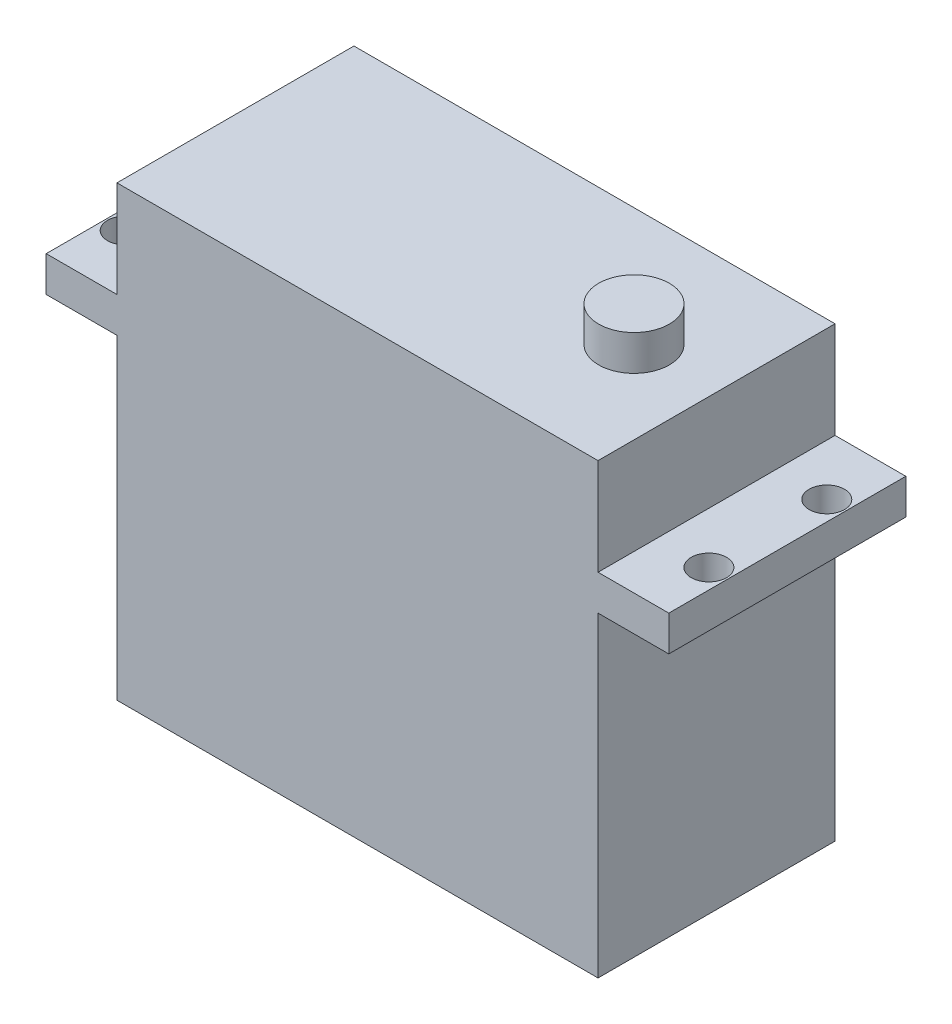
ISO-10303-21;
HEADER;
FILE_DESCRIPTION(('STEP AP214'),'2;1');
FILE_NAME('part.step','',(''),(''),'','','');
FILE_SCHEMA(('AUTOMOTIVE_DESIGN { 1 0 10303 214 1 1 1 1 }'));
ENDSEC;
DATA;
#1=APPLICATION_CONTEXT('core data for automotive mechanical design processes');
#2=APPLICATION_PROTOCOL_DEFINITION('international standard','automotive_design',2000,#1);
#3=PRODUCT_CONTEXT('',#1,'mechanical');
#4=PRODUCT('Part','Part','',(#3));
#5=PRODUCT_RELATED_PRODUCT_CATEGORY('part','',(#4));
#6=PRODUCT_DEFINITION_FORMATION('','',#4);
#7=PRODUCT_DEFINITION_CONTEXT('part definition',#1,'design');
#8=PRODUCT_DEFINITION('design','',#6,#7);
#9=PRODUCT_DEFINITION_SHAPE('','',#8);
#10=(LENGTH_UNIT() NAMED_UNIT(*) SI_UNIT(.MILLI.,.METRE.));
#11=(NAMED_UNIT(*) PLANE_ANGLE_UNIT() SI_UNIT($,.RADIAN.));
#12=(NAMED_UNIT(*) SI_UNIT($,.STERADIAN.) SOLID_ANGLE_UNIT());
#13=UNCERTAINTY_MEASURE_WITH_UNIT(LENGTH_MEASURE(1.E-05),#10,'distance_accuracy_value','');
#14=(GEOMETRIC_REPRESENTATION_CONTEXT(3) GLOBAL_UNCERTAINTY_ASSIGNED_CONTEXT((#13)) GLOBAL_UNIT_ASSIGNED_CONTEXT((#10,
#11,#12)) REPRESENTATION_CONTEXT('',''));
#15=CARTESIAN_POINT('',(0.,0.,0.));
#16=DIRECTION('',(0.,0.,1.));
#17=DIRECTION('',(1.,0.,0.));
#18=AXIS2_PLACEMENT_3D('',#15,#16,#17);
#19=CARTESIAN_POINT('',(0.,26.8,20.1));
#20=DIRECTION('',(1.,0.,0.));
#21=DIRECTION('',(0.,1.,0.));
#22=AXIS2_PLACEMENT_3D('',#19,#20,#21);
#23=PLANE('',#22);
#24=DIRECTION('',(0.,-1.,0.));
#25=VECTOR('',#24,1.);
#26=CARTESIAN_POINT('',(0.,26.8,0.));
#27=LINE('',#26,#25);
#28=CARTESIAN_POINT('',(0.,26.8,0.));
#29=VERTEX_POINT('',#28);
#30=CARTESIAN_POINT('',(0.,0.,0.));
#31=VERTEX_POINT('',#30);
#32=EDGE_CURVE('E164',#29,#31,#27,.T.);
#33=ORIENTED_EDGE('',*,*,#32,.T.);
#34=DIRECTION('',(0.,0.,-1.));
#35=VECTOR('',#34,1.);
#36=CARTESIAN_POINT('',(0.,0.,20.1));
#37=LINE('',#36,#35);
#38=CARTESIAN_POINT('',(0.,0.,20.1));
#39=VERTEX_POINT('',#38);
#40=EDGE_CURVE('E47',#39,#31,#37,.T.);
#41=ORIENTED_EDGE('',*,*,#40,.F.);
#42=DIRECTION('',(0.,-1.,0.));
#43=VECTOR('',#42,1.);
#44=CARTESIAN_POINT('',(0.,26.8,20.1));
#45=LINE('',#44,#43);
#46=CARTESIAN_POINT('',(0.,26.8,20.1));
#47=VERTEX_POINT('',#46);
#48=EDGE_CURVE('E199',#47,#39,#45,.T.);
#49=ORIENTED_EDGE('',*,*,#48,.F.);
#50=DIRECTION('',(0.,0.,-1.));
#51=VECTOR('',#50,1.);
#52=CARTESIAN_POINT('',(0.,26.8,20.1));
#53=LINE('',#52,#51);
#54=EDGE_CURVE('E160',#47,#29,#53,.T.);
#55=ORIENTED_EDGE('',*,*,#54,.T.);
#56=EDGE_LOOP('',(#33,#41,#49,#55));
#57=FACE_BOUND('',#56,.T.);
#58=ADVANCED_FACE('F38',(#57),#23,.F.);
#59=CARTESIAN_POINT('',(0.,0.,20.1));
#60=DIRECTION('',(0.,1.,0.));
#61=DIRECTION('',(0.,0.,1.));
#62=AXIS2_PLACEMENT_3D('',#59,#60,#61);
#63=PLANE('',#62);
#64=DIRECTION('',(1.,0.,0.));
#65=VECTOR('',#64,1.);
#66=CARTESIAN_POINT('',(0.,0.,0.));
#67=LINE('',#66,#65);
#68=CARTESIAN_POINT('',(40.8,0.,0.));
#69=VERTEX_POINT('',#68);
#70=EDGE_CURVE('E168',#31,#69,#67,.T.);
#71=ORIENTED_EDGE('',*,*,#70,.T.);
#72=DIRECTION('',(0.,0.,-1.));
#73=VECTOR('',#72,1.);
#74=CARTESIAN_POINT('',(40.8,0.,20.1));
#75=LINE('',#74,#73);
#76=CARTESIAN_POINT('',(40.8,0.,20.1));
#77=VERTEX_POINT('',#76);
#78=EDGE_CURVE('E230',#77,#69,#75,.T.);
#79=ORIENTED_EDGE('',*,*,#78,.F.);
#80=DIRECTION('',(1.,0.,0.));
#81=VECTOR('',#80,1.);
#82=CARTESIAN_POINT('',(0.,0.,20.1));
#83=LINE('',#82,#81);
#84=EDGE_CURVE('E111',#39,#77,#83,.T.);
#85=ORIENTED_EDGE('',*,*,#84,.F.);
#86=ORIENTED_EDGE('',*,*,#40,.T.);
#87=EDGE_LOOP('',(#71,#79,#85,#86));
#88=FACE_BOUND('',#87,.T.);
#89=ADVANCED_FACE('F235',(#88),#63,.F.);
#90=CARTESIAN_POINT('',(40.8,0.,20.1));
#91=DIRECTION('',(-1.,0.,0.));
#92=DIRECTION('',(0.,0.,1.));
#93=AXIS2_PLACEMENT_3D('',#90,#91,#92);
#94=PLANE('',#93);
#95=DIRECTION('',(0.,1.,0.));
#96=VECTOR('',#95,1.);
#97=CARTESIAN_POINT('',(40.8,0.,0.));
#98=LINE('',#97,#96);
#99=CARTESIAN_POINT('',(40.8,26.8,0.));
#100=VERTEX_POINT('',#99);
#101=EDGE_CURVE('E172',#69,#100,#98,.T.);
#102=ORIENTED_EDGE('',*,*,#101,.T.);
#103=DIRECTION('',(0.,0.,-1.));
#104=VECTOR('',#103,1.);
#105=CARTESIAN_POINT('',(40.8,26.8,20.1));
#106=LINE('',#105,#104);
#107=CARTESIAN_POINT('',(40.8,26.8,20.1));
#108=VERTEX_POINT('',#107);
#109=EDGE_CURVE('E226',#108,#100,#106,.T.);
#110=ORIENTED_EDGE('',*,*,#109,.F.);
#111=DIRECTION('',(0.,1.,0.));
#112=VECTOR('',#111,1.);
#113=CARTESIAN_POINT('',(40.8,0.,20.1));
#114=LINE('',#113,#112);
#115=EDGE_CURVE('E256',#77,#108,#114,.T.);
#116=ORIENTED_EDGE('',*,*,#115,.F.);
#117=ORIENTED_EDGE('',*,*,#78,.T.);
#118=EDGE_LOOP('',(#102,#110,#116,#117));
#119=FACE_BOUND('',#118,.T.);
#120=ADVANCED_FACE('F246',(#119),#94,.F.);
#121=CARTESIAN_POINT('',(40.8,26.8,20.1));
#122=DIRECTION('',(0.,1.,0.));
#123=DIRECTION('',(0.,0.,1.));
#124=AXIS2_PLACEMENT_3D('',#121,#122,#123);
#125=PLANE('',#124);
#126=CARTESIAN_POINT('',(45.15,26.8,5.05));
#127=DIRECTION('',(0.,1.,0.));
#128=DIRECTION('',(0.,0.,1.));
#129=AXIS2_PLACEMENT_3D('',#126,#127,#128);
#130=CIRCLE('',#129,1.5);
#131=CARTESIAN_POINT('',(45.15,26.8,6.55));
#132=VERTEX_POINT('',#131);
#133=EDGE_CURVE('E480',#132,#132,#130,.F.);
#134=ORIENTED_EDGE('',*,*,#133,.F.);
#135=EDGE_LOOP('',(#134));
#136=FACE_BOUND('',#135,.T.);
#137=CARTESIAN_POINT('',(45.15,26.8,15.05));
#138=DIRECTION('',(0.,1.,0.));
#139=DIRECTION('',(0.,0.,1.));
#140=AXIS2_PLACEMENT_3D('',#137,#138,#139);
#141=CIRCLE('',#140,1.5);
#142=CARTESIAN_POINT('',(45.15,26.8,16.55));
#143=VERTEX_POINT('',#142);
#144=EDGE_CURVE('E467',#143,#143,#141,.F.);
#145=ORIENTED_EDGE('',*,*,#144,.F.);
#146=EDGE_LOOP('',(#145));
#147=FACE_BOUND('',#146,.T.);
#148=DIRECTION('',(1.,0.,0.));
#149=VECTOR('',#148,1.);
#150=CARTESIAN_POINT('',(40.8,26.8,0.));
#151=LINE('',#150,#149);
#152=CARTESIAN_POINT('',(46.8,26.8,0.));
#153=VERTEX_POINT('',#152);
#154=EDGE_CURVE('E175',#100,#153,#151,.T.);
#155=ORIENTED_EDGE('',*,*,#154,.T.);
#156=DIRECTION('',(0.,0.,-1.));
#157=VECTOR('',#156,1.);
#158=CARTESIAN_POINT('',(46.8,26.8,20.1));
#159=LINE('',#158,#157);
#160=CARTESIAN_POINT('',(46.8,26.8,20.1));
#161=VERTEX_POINT('',#160);
#162=EDGE_CURVE('E222',#161,#153,#159,.T.);
#163=ORIENTED_EDGE('',*,*,#162,.F.);
#164=DIRECTION('',(1.,0.,0.));
#165=VECTOR('',#164,1.);
#166=CARTESIAN_POINT('',(40.8,26.8,20.1));
#167=LINE('',#166,#165);
#168=EDGE_CURVE('E252',#108,#161,#167,.T.);
#169=ORIENTED_EDGE('',*,*,#168,.F.);
#170=ORIENTED_EDGE('',*,*,#109,.T.);
#171=EDGE_LOOP('',(#155,#163,#169,#170));
#172=FACE_BOUND('',#171,.T.);
#173=ADVANCED_FACE('F250',(#136,#147,#172),#125,.F.);
#174=CARTESIAN_POINT('',(46.8,26.8,20.1));
#175=DIRECTION('',(-1.,0.,0.));
#176=DIRECTION('',(0.,0.,1.));
#177=AXIS2_PLACEMENT_3D('',#174,#175,#176);
#178=PLANE('',#177);
#179=DIRECTION('',(0.,1.,0.));
#180=VECTOR('',#179,1.);
#181=CARTESIAN_POINT('',(46.8,26.8,0.));
#182=LINE('',#181,#180);
#183=CARTESIAN_POINT('',(46.8,29.8,0.));
#184=VERTEX_POINT('',#183);
#185=EDGE_CURVE('E178',#153,#184,#182,.T.);
#186=ORIENTED_EDGE('',*,*,#185,.T.);
#187=DIRECTION('',(0.,0.,-1.));
#188=VECTOR('',#187,1.);
#189=CARTESIAN_POINT('',(46.8,29.8,20.1));
#190=LINE('',#189,#188);
#191=CARTESIAN_POINT('',(46.8,29.8,20.1));
#192=VERTEX_POINT('',#191);
#193=EDGE_CURVE('E218',#192,#184,#190,.T.);
#194=ORIENTED_EDGE('',*,*,#193,.F.);
#195=DIRECTION('',(0.,1.,0.));
#196=VECTOR('',#195,1.);
#197=CARTESIAN_POINT('',(46.8,26.8,20.1));
#198=LINE('',#197,#196);
#199=EDGE_CURVE('E255',#161,#192,#198,.T.);
#200=ORIENTED_EDGE('',*,*,#199,.F.);
#201=ORIENTED_EDGE('',*,*,#162,.T.);
#202=EDGE_LOOP('',(#186,#194,#200,#201));
#203=FACE_BOUND('',#202,.T.);
#204=ADVANCED_FACE('F293',(#203),#178,.F.);
#205=CARTESIAN_POINT('',(46.8,29.8,20.1));
#206=DIRECTION('',(0.,-1.,0.));
#207=DIRECTION('',(0.,0.,-1.));
#208=AXIS2_PLACEMENT_3D('',#205,#206,#207);
#209=PLANE('',#208);
#210=CARTESIAN_POINT('',(45.15,29.8,5.05));
#211=DIRECTION('',(0.,1.,0.));
#212=DIRECTION('',(0.,0.,1.));
#213=AXIS2_PLACEMENT_3D('',#210,#211,#212);
#214=CIRCLE('',#213,1.5);
#215=CARTESIAN_POINT('',(45.15,29.8,6.55));
#216=VERTEX_POINT('',#215);
#217=EDGE_CURVE('E494',#216,#216,#214,.T.);
#218=ORIENTED_EDGE('',*,*,#217,.F.);
#219=EDGE_LOOP('',(#218));
#220=FACE_BOUND('',#219,.T.);
#221=CARTESIAN_POINT('',(45.15,29.8,15.05));
#222=DIRECTION('',(0.,1.,0.));
#223=DIRECTION('',(0.,0.,1.));
#224=AXIS2_PLACEMENT_3D('',#221,#222,#223);
#225=CIRCLE('',#224,1.5);
#226=CARTESIAN_POINT('',(45.15,29.8,16.55));
#227=VERTEX_POINT('',#226);
#228=EDGE_CURVE('E471',#227,#227,#225,.T.);
#229=ORIENTED_EDGE('',*,*,#228,.F.);
#230=EDGE_LOOP('',(#229));
#231=FACE_BOUND('',#230,.T.);
#232=DIRECTION('',(-1.,0.,0.));
#233=VECTOR('',#232,1.);
#234=CARTESIAN_POINT('',(46.8,29.8,0.));
#235=LINE('',#234,#233);
#236=CARTESIAN_POINT('',(40.8,29.8,0.));
#237=VERTEX_POINT('',#236);
#238=EDGE_CURVE('E181',#184,#237,#235,.T.);
#239=ORIENTED_EDGE('',*,*,#238,.T.);
#240=DIRECTION('',(0.,0.,-1.));
#241=VECTOR('',#240,1.);
#242=CARTESIAN_POINT('',(40.8,29.8,20.1));
#243=LINE('',#242,#241);
#244=CARTESIAN_POINT('',(40.8,29.8,20.1));
#245=VERTEX_POINT('',#244);
#246=EDGE_CURVE('E214',#245,#237,#243,.T.);
#247=ORIENTED_EDGE('',*,*,#246,.F.);
#248=DIRECTION('',(-1.,0.,0.));
#249=VECTOR('',#248,1.);
#250=CARTESIAN_POINT('',(46.8,29.8,20.1));
#251=LINE('',#250,#249);
#252=EDGE_CURVE('E260',#192,#245,#251,.T.);
#253=ORIENTED_EDGE('',*,*,#252,.F.);
#254=ORIENTED_EDGE('',*,*,#193,.T.);
#255=EDGE_LOOP('',(#239,#247,#253,#254));
#256=FACE_BOUND('',#255,.T.);
#257=ADVANCED_FACE('F290',(#220,#231,#256),#209,.F.);
#258=CARTESIAN_POINT('',(40.8,29.8,20.1));
#259=DIRECTION('',(-1.,0.,0.));
#260=DIRECTION('',(0.,0.,1.));
#261=AXIS2_PLACEMENT_3D('',#258,#259,#260);
#262=PLANE('',#261);
#263=DIRECTION('',(0.,1.,0.));
#264=VECTOR('',#263,1.);
#265=CARTESIAN_POINT('',(40.8,29.8,0.));
#266=LINE('',#265,#264);
#267=CARTESIAN_POINT('',(40.8,38.,0.));
#268=VERTEX_POINT('',#267);
#269=EDGE_CURVE('E184',#237,#268,#266,.T.);
#270=ORIENTED_EDGE('',*,*,#269,.T.);
#271=DIRECTION('',(0.,0.,-1.));
#272=VECTOR('',#271,1.);
#273=CARTESIAN_POINT('',(40.8,38.,20.1));
#274=LINE('',#273,#272);
#275=CARTESIAN_POINT('',(40.8,38.,20.1));
#276=VERTEX_POINT('',#275);
#277=EDGE_CURVE('E210',#276,#268,#274,.T.);
#278=ORIENTED_EDGE('',*,*,#277,.F.);
#279=DIRECTION('',(0.,1.,0.));
#280=VECTOR('',#279,1.);
#281=CARTESIAN_POINT('',(40.8,29.8,20.1));
#282=LINE('',#281,#280);
#283=EDGE_CURVE('E267',#245,#276,#282,.T.);
#284=ORIENTED_EDGE('',*,*,#283,.F.);
#285=ORIENTED_EDGE('',*,*,#246,.T.);
#286=EDGE_LOOP('',(#270,#278,#284,#285));
#287=FACE_BOUND('',#286,.T.);
#288=ADVANCED_FACE('F286',(#287),#262,.F.);
#289=CARTESIAN_POINT('',(40.8,38.,20.1));
#290=DIRECTION('',(0.,-1.,0.));
#291=DIRECTION('',(1.,0.,0.));
#292=AXIS2_PLACEMENT_3D('',#289,#290,#291);
#293=PLANE('',#292);
#294=CARTESIAN_POINT('',(33.8,38.,10.05));
#295=DIRECTION('',(0.,-1.,0.));
#296=DIRECTION('',(1.,0.,0.));
#297=AXIS2_PLACEMENT_3D('',#294,#295,#296);
#298=CIRCLE('',#297,3.);
#299=CARTESIAN_POINT('',(36.8,38.,10.05));
#300=VERTEX_POINT('',#299);
#301=EDGE_CURVE('E11',#300,#300,#298,.F.);
#302=ORIENTED_EDGE('',*,*,#301,.F.);
#303=EDGE_LOOP('',(#302));
#304=FACE_BOUND('',#303,.T.);
#305=DIRECTION('',(-1.,0.,0.));
#306=VECTOR('',#305,1.);
#307=CARTESIAN_POINT('',(40.8,38.,0.));
#308=LINE('',#307,#306);
#309=CARTESIAN_POINT('',(0.,38.,0.));
#310=VERTEX_POINT('',#309);
#311=EDGE_CURVE('E187',#268,#310,#308,.T.);
#312=ORIENTED_EDGE('',*,*,#311,.T.);
#313=DIRECTION('',(0.,0.,-1.));
#314=VECTOR('',#313,1.);
#315=CARTESIAN_POINT('',(0.,38.,20.1));
#316=LINE('',#315,#314);
#317=CARTESIAN_POINT('',(0.,38.,20.1));
#318=VERTEX_POINT('',#317);
#319=EDGE_CURVE('E206',#318,#310,#316,.T.);
#320=ORIENTED_EDGE('',*,*,#319,.F.);
#321=DIRECTION('',(-1.,0.,0.));
#322=VECTOR('',#321,1.);
#323=CARTESIAN_POINT('',(40.8,38.,20.1));
#324=LINE('',#323,#322);
#325=EDGE_CURVE('E270',#276,#318,#324,.T.);
#326=ORIENTED_EDGE('',*,*,#325,.F.);
#327=ORIENTED_EDGE('',*,*,#277,.T.);
#328=EDGE_LOOP('',(#312,#320,#326,#327));
#329=FACE_BOUND('',#328,.T.);
#330=ADVANCED_FACE('F278',(#304,#329),#293,.F.);
#331=CARTESIAN_POINT('',(0.,38.,20.1));
#332=DIRECTION('',(1.,0.,0.));
#333=DIRECTION('',(0.,1.,0.));
#334=AXIS2_PLACEMENT_3D('',#331,#332,#333);
#335=PLANE('',#334);
#336=DIRECTION('',(0.,-1.,0.));
#337=VECTOR('',#336,1.);
#338=CARTESIAN_POINT('',(0.,38.,0.));
#339=LINE('',#338,#337);
#340=CARTESIAN_POINT('',(0.,29.8,0.));
#341=VERTEX_POINT('',#340);
#342=EDGE_CURVE('E190',#310,#341,#339,.T.);
#343=ORIENTED_EDGE('',*,*,#342,.T.);
#344=DIRECTION('',(0.,0.,-1.));
#345=VECTOR('',#344,1.);
#346=CARTESIAN_POINT('',(0.,29.8,20.1));
#347=LINE('',#346,#345);
#348=CARTESIAN_POINT('',(0.,29.8,20.1));
#349=VERTEX_POINT('',#348);
#350=EDGE_CURVE('E153',#349,#341,#347,.T.);
#351=ORIENTED_EDGE('',*,*,#350,.F.);
#352=DIRECTION('',(0.,-1.,0.));
#353=VECTOR('',#352,1.);
#354=CARTESIAN_POINT('',(0.,38.,20.1));
#355=LINE('',#354,#353);
#356=EDGE_CURVE('E142',#318,#349,#355,.T.);
#357=ORIENTED_EDGE('',*,*,#356,.F.);
#358=ORIENTED_EDGE('',*,*,#319,.T.);
#359=EDGE_LOOP('',(#343,#351,#357,#358));
#360=FACE_BOUND('',#359,.T.);
#361=ADVANCED_FACE('F282',(#360),#335,.F.);
#362=CARTESIAN_POINT('',(0.,29.8,20.1));
#363=DIRECTION('',(0.,-1.,0.));
#364=DIRECTION('',(0.,0.,-1.));
#365=AXIS2_PLACEMENT_3D('',#362,#363,#364);
#366=PLANE('',#365);
#367=CARTESIAN_POINT('',(-4.35,29.8,15.05));
#368=DIRECTION('',(0.,1.,0.));
#369=DIRECTION('',(0.,0.,-1.));
#370=AXIS2_PLACEMENT_3D('',#367,#368,#369);
#371=CIRCLE('',#370,1.5);
#372=CARTESIAN_POINT('',(-4.35,29.8,13.55));
#373=VERTEX_POINT('',#372);
#374=EDGE_CURVE('E486',#373,#373,#371,.T.);
#375=ORIENTED_EDGE('',*,*,#374,.F.);
#376=EDGE_LOOP('',(#375));
#377=FACE_BOUND('',#376,.T.);
#378=CARTESIAN_POINT('',(-4.35,29.8,5.05));
#379=DIRECTION('',(0.,1.,0.));
#380=DIRECTION('',(0.,0.,-1.));
#381=AXIS2_PLACEMENT_3D('',#378,#379,#380);
#382=CIRCLE('',#381,1.5);
#383=CARTESIAN_POINT('',(-4.35,29.8,3.55));
#384=VERTEX_POINT('',#383);
#385=EDGE_CURVE('E485',#384,#384,#382,.T.);
#386=ORIENTED_EDGE('',*,*,#385,.F.);
#387=EDGE_LOOP('',(#386));
#388=FACE_BOUND('',#387,.T.);
#389=DIRECTION('',(-1.,0.,0.));
#390=VECTOR('',#389,1.);
#391=CARTESIAN_POINT('',(0.,29.8,0.));
#392=LINE('',#391,#390);
#393=CARTESIAN_POINT('',(-6.,29.8,0.));
#394=VERTEX_POINT('',#393);
#395=EDGE_CURVE('E151',#341,#394,#392,.T.);
#396=ORIENTED_EDGE('',*,*,#395,.T.);
#397=DIRECTION('',(0.,0.,-1.));
#398=VECTOR('',#397,1.);
#399=CARTESIAN_POINT('',(-6.,29.8,20.1));
#400=LINE('',#399,#398);
#401=CARTESIAN_POINT('',(-6.,29.8,20.1));
#402=VERTEX_POINT('',#401);
#403=EDGE_CURVE('E148',#402,#394,#400,.T.);
#404=ORIENTED_EDGE('',*,*,#403,.F.);
#405=DIRECTION('',(-1.,0.,0.));
#406=VECTOR('',#405,1.);
#407=CARTESIAN_POINT('',(0.,29.8,20.1));
#408=LINE('',#407,#406);
#409=EDGE_CURVE('E136',#349,#402,#408,.T.);
#410=ORIENTED_EDGE('',*,*,#409,.F.);
#411=ORIENTED_EDGE('',*,*,#350,.T.);
#412=EDGE_LOOP('',(#396,#404,#410,#411));
#413=FACE_BOUND('',#412,.T.);
#414=ADVANCED_FACE('F149',(#377,#388,#413),#366,.F.);
#415=CARTESIAN_POINT('',(-6.,29.8,20.1));
#416=DIRECTION('',(1.,0.,0.));
#417=DIRECTION('',(0.,0.,-1.));
#418=AXIS2_PLACEMENT_3D('',#415,#416,#417);
#419=PLANE('',#418);
#420=DIRECTION('',(0.,-1.,0.));
#421=VECTOR('',#420,1.);
#422=CARTESIAN_POINT('',(-6.,29.8,0.));
#423=LINE('',#422,#421);
#424=CARTESIAN_POINT('',(-6.,26.8,0.));
#425=VERTEX_POINT('',#424);
#426=EDGE_CURVE('E96',#394,#425,#423,.T.);
#427=ORIENTED_EDGE('',*,*,#426,.T.);
#428=DIRECTION('',(0.,0.,-1.));
#429=VECTOR('',#428,1.);
#430=CARTESIAN_POINT('',(-6.,26.8,20.1));
#431=LINE('',#430,#429);
#432=CARTESIAN_POINT('',(-6.,26.8,20.1));
#433=VERTEX_POINT('',#432);
#434=EDGE_CURVE('E154',#433,#425,#431,.T.);
#435=ORIENTED_EDGE('',*,*,#434,.F.);
#436=DIRECTION('',(0.,-1.,0.));
#437=VECTOR('',#436,1.);
#438=CARTESIAN_POINT('',(-6.,29.8,20.1));
#439=LINE('',#438,#437);
#440=EDGE_CURVE('E140',#402,#433,#439,.T.);
#441=ORIENTED_EDGE('',*,*,#440,.F.);
#442=ORIENTED_EDGE('',*,*,#403,.T.);
#443=EDGE_LOOP('',(#427,#435,#441,#442));
#444=FACE_BOUND('',#443,.T.);
#445=ADVANCED_FACE('F156',(#444),#419,.F.);
#446=CARTESIAN_POINT('',(-6.,26.8,20.1));
#447=DIRECTION('',(0.,1.,0.));
#448=DIRECTION('',(0.,0.,1.));
#449=AXIS2_PLACEMENT_3D('',#446,#447,#448);
#450=PLANE('',#449);
#451=CARTESIAN_POINT('',(-4.35,26.8,15.05));
#452=DIRECTION('',(0.,1.,0.));
#453=DIRECTION('',(0.,0.,1.));
#454=AXIS2_PLACEMENT_3D('',#451,#452,#453);
#455=CIRCLE('',#454,1.5);
#456=CARTESIAN_POINT('',(-4.35,26.8,16.55));
#457=VERTEX_POINT('',#456);
#458=EDGE_CURVE('E481',#457,#457,#455,.F.);
#459=ORIENTED_EDGE('',*,*,#458,.F.);
#460=EDGE_LOOP('',(#459));
#461=FACE_BOUND('',#460,.T.);
#462=CARTESIAN_POINT('',(-4.35,26.8,5.05));
#463=DIRECTION('',(0.,1.,0.));
#464=DIRECTION('',(0.,0.,1.));
#465=AXIS2_PLACEMENT_3D('',#462,#463,#464);
#466=CIRCLE('',#465,1.5);
#467=CARTESIAN_POINT('',(-4.35,26.8,6.55));
#468=VERTEX_POINT('',#467);
#469=EDGE_CURVE('E490',#468,#468,#466,.F.);
#470=ORIENTED_EDGE('',*,*,#469,.F.);
#471=EDGE_LOOP('',(#470));
#472=FACE_BOUND('',#471,.T.);
#473=DIRECTION('',(1.,0.,0.));
#474=VECTOR('',#473,1.);
#475=CARTESIAN_POINT('',(-6.,26.8,0.));
#476=LINE('',#475,#474);
#477=EDGE_CURVE('E102',#425,#29,#476,.T.);
#478=ORIENTED_EDGE('',*,*,#477,.T.);
#479=ORIENTED_EDGE('',*,*,#54,.F.);
#480=DIRECTION('',(1.,0.,0.));
#481=VECTOR('',#480,1.);
#482=CARTESIAN_POINT('',(-6.,26.8,20.1));
#483=LINE('',#482,#481);
#484=EDGE_CURVE('E55',#433,#47,#483,.T.);
#485=ORIENTED_EDGE('',*,*,#484,.F.);
#486=ORIENTED_EDGE('',*,*,#434,.T.);
#487=EDGE_LOOP('',(#478,#479,#485,#486));
#488=FACE_BOUND('',#487,.T.);
#489=ADVANCED_FACE('F344',(#461,#472,#488),#450,.F.);
#490=CARTESIAN_POINT('',(0.,0.,20.1));
#491=DIRECTION('',(0.,0.,1.));
#492=DIRECTION('',(1.,0.,0.));
#493=AXIS2_PLACEMENT_3D('',#490,#491,#492);
#494=PLANE('',#493);
#495=ORIENTED_EDGE('',*,*,#48,.T.);
#496=ORIENTED_EDGE('',*,*,#84,.T.);
#497=ORIENTED_EDGE('',*,*,#115,.T.);
#498=ORIENTED_EDGE('',*,*,#168,.T.);
#499=ORIENTED_EDGE('',*,*,#199,.T.);
#500=ORIENTED_EDGE('',*,*,#252,.T.);
#501=ORIENTED_EDGE('',*,*,#283,.T.);
#502=ORIENTED_EDGE('',*,*,#325,.T.);
#503=ORIENTED_EDGE('',*,*,#356,.T.);
#504=ORIENTED_EDGE('',*,*,#409,.T.);
#505=ORIENTED_EDGE('',*,*,#440,.T.);
#506=ORIENTED_EDGE('',*,*,#484,.T.);
#507=EDGE_LOOP('',(#495,#496,#497,#498,#499,#500,#501,#502,#503,#504,#505,#506));
#508=FACE_BOUND('',#507,.T.);
#509=ADVANCED_FACE('F138',(#508),#494,.T.);
#510=CARTESIAN_POINT('',(0.,0.,0.));
#511=DIRECTION('',(0.,0.,1.));
#512=DIRECTION('',(1.,0.,0.));
#513=AXIS2_PLACEMENT_3D('',#510,#511,#512);
#514=PLANE('',#513);
#515=ORIENTED_EDGE('',*,*,#32,.F.);
#516=ORIENTED_EDGE('',*,*,#477,.F.);
#517=ORIENTED_EDGE('',*,*,#426,.F.);
#518=ORIENTED_EDGE('',*,*,#395,.F.);
#519=ORIENTED_EDGE('',*,*,#342,.F.);
#520=ORIENTED_EDGE('',*,*,#311,.F.);
#521=ORIENTED_EDGE('',*,*,#269,.F.);
#522=ORIENTED_EDGE('',*,*,#238,.F.);
#523=ORIENTED_EDGE('',*,*,#185,.F.);
#524=ORIENTED_EDGE('',*,*,#154,.F.);
#525=ORIENTED_EDGE('',*,*,#101,.F.);
#526=ORIENTED_EDGE('',*,*,#70,.F.);
#527=EDGE_LOOP('',(#515,#516,#517,#518,#519,#520,#521,#522,#523,#524,#525,#526));
#528=FACE_BOUND('',#527,.T.);
#529=ADVANCED_FACE('F240',(#528),#514,.F.);
#530=CARTESIAN_POINT('',(33.8,41.,10.05));
#531=DIRECTION('',(0.,-1.,0.));
#532=DIRECTION('',(1.,0.,0.));
#533=AXIS2_PLACEMENT_3D('',#530,#531,#532);
#534=CYLINDRICAL_SURFACE('',#533,3.);
#535=CARTESIAN_POINT('',(33.8,41.,10.05));
#536=DIRECTION('',(0.,1.,0.));
#537=DIRECTION('',(-1.,0.,0.));
#538=AXIS2_PLACEMENT_3D('',#535,#536,#537);
#539=CIRCLE('',#538,3.);
#540=CARTESIAN_POINT('',(30.8,41.,10.05));
#541=VERTEX_POINT('',#540);
#542=EDGE_CURVE('E169',#541,#541,#539,.T.);
#543=ORIENTED_EDGE('',*,*,#542,.F.);
#544=EDGE_LOOP('',(#543));
#545=FACE_BOUND('',#544,.T.);
#546=ORIENTED_EDGE('',*,*,#301,.T.);
#547=EDGE_LOOP('',(#546));
#548=FACE_BOUND('',#547,.T.);
#549=ADVANCED_FACE('F396',(#545,#548),#534,.T.);
#550=CARTESIAN_POINT('',(33.8,41.,10.05));
#551=DIRECTION('',(0.,1.,0.));
#552=DIRECTION('',(-1.,0.,0.));
#553=AXIS2_PLACEMENT_3D('',#550,#551,#552);
#554=PLANE('',#553);
#555=ORIENTED_EDGE('',*,*,#542,.T.);
#556=EDGE_LOOP('',(#555));
#557=FACE_BOUND('',#556,.T.);
#558=ADVANCED_FACE('F325',(#557),#554,.T.);
#559=CARTESIAN_POINT('',(-4.35,-0.001000000000001,5.05));
#560=DIRECTION('',(0.,1.,0.));
#561=DIRECTION('',(0.,0.,1.));
#562=AXIS2_PLACEMENT_3D('',#559,#560,#561);
#563=CYLINDRICAL_SURFACE('',#562,1.5);
#564=ORIENTED_EDGE('',*,*,#385,.T.);
#565=EDGE_LOOP('',(#564));
#566=FACE_BOUND('',#565,.T.);
#567=ORIENTED_EDGE('',*,*,#469,.T.);
#568=EDGE_LOOP('',(#567));
#569=FACE_BOUND('',#568,.T.);
#570=ADVANCED_FACE('F353',(#566,#569),#563,.F.);
#571=CARTESIAN_POINT('',(-4.35,-0.001000000000001,15.05));
#572=DIRECTION('',(0.,1.,0.));
#573=DIRECTION('',(0.,0.,1.));
#574=AXIS2_PLACEMENT_3D('',#571,#572,#573);
#575=CYLINDRICAL_SURFACE('',#574,1.5);
#576=ORIENTED_EDGE('',*,*,#374,.T.);
#577=EDGE_LOOP('',(#576));
#578=FACE_BOUND('',#577,.T.);
#579=ORIENTED_EDGE('',*,*,#458,.T.);
#580=EDGE_LOOP('',(#579));
#581=FACE_BOUND('',#580,.T.);
#582=ADVANCED_FACE('F358',(#578,#581),#575,.F.);
#583=CARTESIAN_POINT('',(45.15,-0.001000000000001,15.05));
#584=DIRECTION('',(0.,1.,0.));
#585=DIRECTION('',(0.,0.,1.));
#586=AXIS2_PLACEMENT_3D('',#583,#584,#585);
#587=CYLINDRICAL_SURFACE('',#586,1.5);
#588=ORIENTED_EDGE('',*,*,#228,.T.);
#589=EDGE_LOOP('',(#588));
#590=FACE_BOUND('',#589,.T.);
#591=ORIENTED_EDGE('',*,*,#144,.T.);
#592=EDGE_LOOP('',(#591));
#593=FACE_BOUND('',#592,.T.);
#594=ADVANCED_FACE('F368',(#590,#593),#587,.F.);
#595=CARTESIAN_POINT('',(45.15,-0.001000000000001,5.05));
#596=DIRECTION('',(0.,1.,0.));
#597=DIRECTION('',(0.,0.,1.));
#598=AXIS2_PLACEMENT_3D('',#595,#596,#597);
#599=CYLINDRICAL_SURFACE('',#598,1.5);
#600=ORIENTED_EDGE('',*,*,#217,.T.);
#601=EDGE_LOOP('',(#600));
#602=FACE_BOUND('',#601,.T.);
#603=ORIENTED_EDGE('',*,*,#133,.T.);
#604=EDGE_LOOP('',(#603));
#605=FACE_BOUND('',#604,.T.);
#606=ADVANCED_FACE('F378',(#602,#605),#599,.F.);
#607=CLOSED_SHELL('',(#58,#89,#120,#173,#204,#257,#288,#330,#361,#414,#445,#489,#509,#529,#549,
#558,#570,#582,#594,#606));
#608=MANIFOLD_SOLID_BREP('B2',#607);
#609=ADVANCED_BREP_SHAPE_REPRESENTATION('',(#18,#608),#14);
#610=SHAPE_DEFINITION_REPRESENTATION(#9,#609);
ENDSEC;
END-ISO-10303-21;
